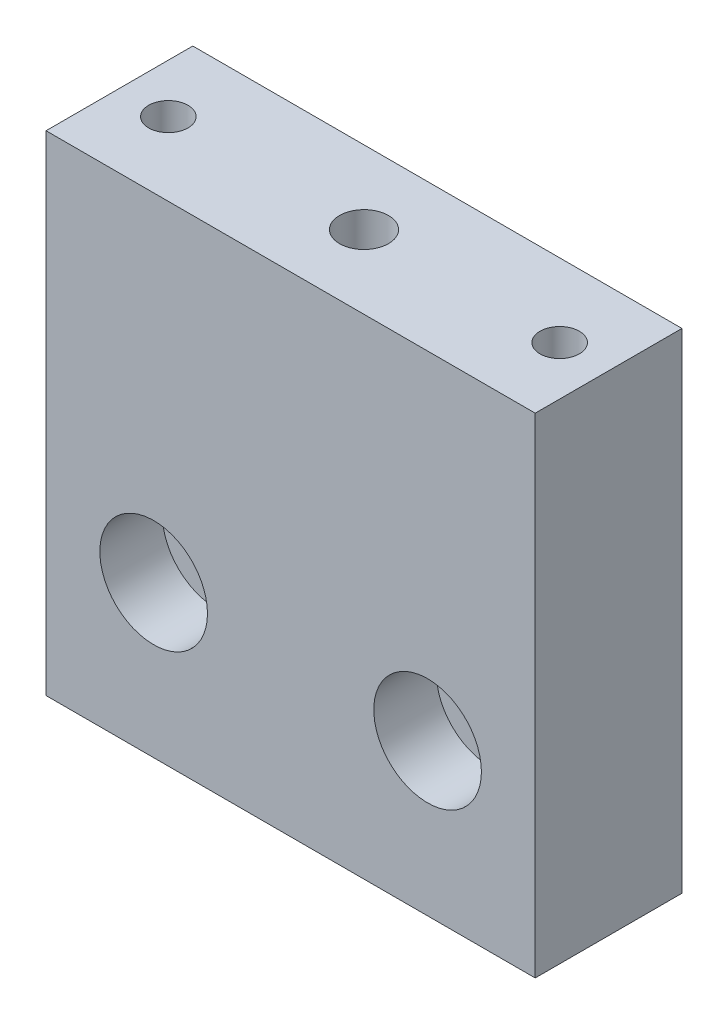
ISO-10303-21;
HEADER;
FILE_DESCRIPTION(('STEP AP214'),'2;1');
FILE_NAME('part.step','',(''),(''),'','','');
FILE_SCHEMA(('AUTOMOTIVE_DESIGN { 1 0 10303 214 1 1 1 1 }'));
ENDSEC;
DATA;
#1=APPLICATION_CONTEXT('core data for automotive mechanical design processes');
#2=APPLICATION_PROTOCOL_DEFINITION('international standard','automotive_design',2000,#1);
#3=PRODUCT_CONTEXT('',#1,'mechanical');
#4=PRODUCT('Part','Part','',(#3));
#5=PRODUCT_RELATED_PRODUCT_CATEGORY('part','',(#4));
#6=PRODUCT_DEFINITION_FORMATION('','',#4);
#7=PRODUCT_DEFINITION_CONTEXT('part definition',#1,'design');
#8=PRODUCT_DEFINITION('design','',#6,#7);
#9=PRODUCT_DEFINITION_SHAPE('','',#8);
#10=(LENGTH_UNIT() NAMED_UNIT(*) SI_UNIT(.MILLI.,.METRE.));
#11=(NAMED_UNIT(*) PLANE_ANGLE_UNIT() SI_UNIT($,.RADIAN.));
#12=(NAMED_UNIT(*) SI_UNIT($,.STERADIAN.) SOLID_ANGLE_UNIT());
#13=UNCERTAINTY_MEASURE_WITH_UNIT(LENGTH_MEASURE(1.E-05),#10,'distance_accuracy_value','');
#14=(GEOMETRIC_REPRESENTATION_CONTEXT(3) GLOBAL_UNCERTAINTY_ASSIGNED_CONTEXT((#13)) GLOBAL_UNIT_ASSIGNED_CONTEXT((#10,
#11,#12)) REPRESENTATION_CONTEXT('',''));
#15=CARTESIAN_POINT('',(0.,0.,0.));
#16=DIRECTION('',(0.,0.,1.));
#17=DIRECTION('',(1.,0.,0.));
#18=AXIS2_PLACEMENT_3D('',#15,#16,#17);
#19=CARTESIAN_POINT('',(-20.,16.9999999999391,7.5));
#20=DIRECTION('',(0.,1.,0.));
#21=DIRECTION('',(0.,0.,1.));
#22=AXIS2_PLACEMENT_3D('',#19,#20,#21);
#23=CONICAL_SURFACE('',#22,1.89999999997099,1.0297442586842);
#24=CARTESIAN_POINT('',(-20.,15.8583648238277,7.5));
#25=VERTEX_POINT('',#24);
#26=VERTEX_LOOP('',#25);
#27=FACE_BOUND('',#26,.T.);
#28=CARTESIAN_POINT('',(-20.,17.,7.5));
#29=DIRECTION('',(0.,1.,0.));
#30=DIRECTION('',(0.,0.,1.));
#31=AXIS2_PLACEMENT_3D('',#28,#29,#30);
#32=CIRCLE('',#31,1.90000000000001);
#33=CARTESIAN_POINT('',(-20.,17.,9.40000000000001));
#34=VERTEX_POINT('',#33);
#35=EDGE_CURVE('E68',#34,#34,#32,.T.);
#36=ORIENTED_EDGE('',*,*,#35,.T.);
#37=EDGE_LOOP('',(#36));
#38=FACE_BOUND('',#37,.T.);
#39=ADVANCED_FACE('F16',(#27,#38),#23,.F.);
#40=CARTESIAN_POINT('',(20.,16.9999999999391,7.49999999999999));
#41=DIRECTION('',(0.,1.,0.));
#42=DIRECTION('',(0.,0.,1.));
#43=AXIS2_PLACEMENT_3D('',#40,#41,#42);
#44=CONICAL_SURFACE('',#43,1.89999999997099,1.0297442586842);
#45=CARTESIAN_POINT('',(20.,15.8583648238277,7.49999999999999));
#46=VERTEX_POINT('',#45);
#47=VERTEX_LOOP('',#46);
#48=FACE_BOUND('',#47,.T.);
#49=CARTESIAN_POINT('',(20.,17.,7.49999999999999));
#50=DIRECTION('',(0.,1.,0.));
#51=DIRECTION('',(0.,0.,1.));
#52=AXIS2_PLACEMENT_3D('',#49,#50,#51);
#53=CIRCLE('',#52,1.90000000000001);
#54=CARTESIAN_POINT('',(20.,17.,9.4));
#55=VERTEX_POINT('',#54);
#56=EDGE_CURVE('E70',#55,#55,#53,.T.);
#57=ORIENTED_EDGE('',*,*,#56,.T.);
#58=EDGE_LOOP('',(#57));
#59=FACE_BOUND('',#58,.T.);
#60=ADVANCED_FACE('F65',(#48,#59),#44,.F.);
#61=CARTESIAN_POINT('',(-20.,25.,7.5));
#62=DIRECTION('',(0.,1.,0.));
#63=DIRECTION('',(0.,0.,1.));
#64=AXIS2_PLACEMENT_3D('',#61,#62,#63);
#65=CYLINDRICAL_SURFACE('',#64,1.90000000000001);
#66=ORIENTED_EDGE('',*,*,#35,.F.);
#67=EDGE_LOOP('',(#66));
#68=FACE_BOUND('',#67,.T.);
#69=CARTESIAN_POINT('',(-20.,20.,7.5));
#70=DIRECTION('',(0.,1.,0.));
#71=DIRECTION('',(0.,0.,1.));
#72=AXIS2_PLACEMENT_3D('',#69,#70,#71);
#73=CIRCLE('',#72,1.90000000000001);
#74=CARTESIAN_POINT('',(-20.,20.,9.40000000000001));
#75=VERTEX_POINT('',#74);
#76=EDGE_CURVE('E19',#75,#75,#73,.T.);
#77=ORIENTED_EDGE('',*,*,#76,.T.);
#78=EDGE_LOOP('',(#77));
#79=FACE_BOUND('',#78,.T.);
#80=ADVANCED_FACE('F127',(#68,#79),#65,.F.);
#81=CARTESIAN_POINT('',(20.,25.,7.49999999999999));
#82=DIRECTION('',(0.,1.,0.));
#83=DIRECTION('',(0.,0.,1.));
#84=AXIS2_PLACEMENT_3D('',#81,#82,#83);
#85=CYLINDRICAL_SURFACE('',#84,1.90000000000001);
#86=ORIENTED_EDGE('',*,*,#56,.F.);
#87=EDGE_LOOP('',(#86));
#88=FACE_BOUND('',#87,.T.);
#89=CARTESIAN_POINT('',(20.,20.,7.49999999999999));
#90=DIRECTION('',(0.,1.,0.));
#91=DIRECTION('',(0.,0.,1.));
#92=AXIS2_PLACEMENT_3D('',#89,#90,#91);
#93=CIRCLE('',#92,1.90000000000001);
#94=CARTESIAN_POINT('',(20.,20.,9.4));
#95=VERTEX_POINT('',#94);
#96=EDGE_CURVE('E120',#95,#95,#93,.T.);
#97=ORIENTED_EDGE('',*,*,#96,.T.);
#98=EDGE_LOOP('',(#97));
#99=FACE_BOUND('',#98,.T.);
#100=ADVANCED_FACE('F143',(#88,#99),#85,.F.);
#101=CARTESIAN_POINT('',(0.,7.00000000011869,7.5));
#102=DIRECTION('',(0.,1.,0.));
#103=DIRECTION('',(-1.,0.,0.));
#104=AXIS2_PLACEMENT_3D('',#101,#102,#103);
#105=CONICAL_SURFACE('',#104,2.50000000010459,1.0297442586752);
#106=CARTESIAN_POINT('',(0.,5.49784845259182,7.50000000008527));
#107=VERTEX_POINT('',#106);
#108=VERTEX_LOOP('',#107);
#109=FACE_BOUND('',#108,.T.);
#110=CARTESIAN_POINT('',(0.,7.00000000000001,7.5));
#111=DIRECTION('',(0.,1.,0.));
#112=DIRECTION('',(0.,0.,1.));
#113=AXIS2_PLACEMENT_3D('',#110,#111,#112);
#114=CIRCLE('',#113,2.5);
#115=CARTESIAN_POINT('',(0.,7.00000000000001,10.));
#116=VERTEX_POINT('',#115);
#117=EDGE_CURVE('E114',#116,#116,#114,.T.);
#118=ORIENTED_EDGE('',*,*,#117,.T.);
#119=EDGE_LOOP('',(#118));
#120=FACE_BOUND('',#119,.T.);
#121=ADVANCED_FACE('F132',(#109,#120),#105,.F.);
#122=CARTESIAN_POINT('',(-18.1,20.,7.5));
#123=DIRECTION('',(0.,-1.,0.));
#124=DIRECTION('',(0.,0.,-1.));
#125=AXIS2_PLACEMENT_3D('',#122,#123,#124);
#126=PLANE('',#125);
#127=CARTESIAN_POINT('',(-20.,20.,7.5));
#128=DIRECTION('',(0.,1.,0.));
#129=DIRECTION('',(0.,0.,1.));
#130=AXIS2_PLACEMENT_3D('',#127,#128,#129);
#131=CIRCLE('',#130,2.01);
#132=CARTESIAN_POINT('',(-20.,20.,9.51));
#133=VERTEX_POINT('',#132);
#134=EDGE_CURVE('E111',#133,#133,#131,.T.);
#135=ORIENTED_EDGE('',*,*,#134,.T.);
#136=EDGE_LOOP('',(#135));
#137=FACE_BOUND('',#136,.T.);
#138=ORIENTED_EDGE('',*,*,#76,.F.);
#139=EDGE_LOOP('',(#138));
#140=FACE_BOUND('',#139,.T.);
#141=ADVANCED_FACE('F129',(#137,#140),#126,.F.);
#142=CARTESIAN_POINT('',(21.9,20.,7.49999999999999));
#143=DIRECTION('',(0.,-1.,0.));
#144=DIRECTION('',(0.,0.,-1.));
#145=AXIS2_PLACEMENT_3D('',#142,#143,#144);
#146=PLANE('',#145);
#147=CARTESIAN_POINT('',(20.,20.,7.49999999999999));
#148=DIRECTION('',(0.,1.,0.));
#149=DIRECTION('',(0.,0.,1.));
#150=AXIS2_PLACEMENT_3D('',#147,#148,#149);
#151=CIRCLE('',#150,2.01);
#152=CARTESIAN_POINT('',(20.,20.,9.50999999999999));
#153=VERTEX_POINT('',#152);
#154=EDGE_CURVE('E108',#153,#153,#151,.T.);
#155=ORIENTED_EDGE('',*,*,#154,.T.);
#156=EDGE_LOOP('',(#155));
#157=FACE_BOUND('',#156,.T.);
#158=ORIENTED_EDGE('',*,*,#96,.F.);
#159=EDGE_LOOP('',(#158));
#160=FACE_BOUND('',#159,.T.);
#161=ADVANCED_FACE('F131',(#157,#160),#146,.F.);
#162=CARTESIAN_POINT('',(-14.,-9.49999999999999,15.));
#163=DIRECTION('',(0.,0.,1.));
#164=DIRECTION('',(1.,0.,0.));
#165=AXIS2_PLACEMENT_3D('',#162,#163,#164);
#166=CYLINDRICAL_SURFACE('',#165,5.5);
#167=CARTESIAN_POINT('',(-14.,-9.49999999999999,15.));
#168=DIRECTION('',(0.,0.,1.));
#169=DIRECTION('',(1.,0.,0.));
#170=AXIS2_PLACEMENT_3D('',#167,#168,#169);
#171=CIRCLE('',#170,5.5);
#172=CARTESIAN_POINT('',(-8.5,-9.49999999999999,15.));
#173=VERTEX_POINT('',#172);
#174=EDGE_CURVE('E105',#173,#173,#171,.F.);
#175=ORIENTED_EDGE('',*,*,#174,.F.);
#176=EDGE_LOOP('',(#175));
#177=FACE_BOUND('',#176,.T.);
#178=CARTESIAN_POINT('',(-14.,-9.49999999999999,8.6));
#179=DIRECTION('',(0.,0.,1.));
#180=DIRECTION('',(1.,0.,0.));
#181=AXIS2_PLACEMENT_3D('',#178,#179,#180);
#182=CIRCLE('',#181,5.5);
#183=CARTESIAN_POINT('',(-8.5,-9.49999999999999,8.6));
#184=VERTEX_POINT('',#183);
#185=EDGE_CURVE('E118',#184,#184,#182,.F.);
#186=ORIENTED_EDGE('',*,*,#185,.T.);
#187=EDGE_LOOP('',(#186));
#188=FACE_BOUND('',#187,.T.);
#189=ADVANCED_FACE('F140',(#177,#188),#166,.F.);
#190=CARTESIAN_POINT('',(14.,-9.49999999999999,15.));
#191=DIRECTION('',(0.,0.,1.));
#192=DIRECTION('',(1.,0.,0.));
#193=AXIS2_PLACEMENT_3D('',#190,#191,#192);
#194=CYLINDRICAL_SURFACE('',#193,5.5);
#195=CARTESIAN_POINT('',(14.,-9.49999999999999,15.));
#196=DIRECTION('',(0.,0.,1.));
#197=DIRECTION('',(1.,0.,0.));
#198=AXIS2_PLACEMENT_3D('',#195,#196,#197);
#199=CIRCLE('',#198,5.5);
#200=CARTESIAN_POINT('',(19.5,-9.49999999999999,15.));
#201=VERTEX_POINT('',#200);
#202=EDGE_CURVE('E102',#201,#201,#199,.F.);
#203=ORIENTED_EDGE('',*,*,#202,.F.);
#204=EDGE_LOOP('',(#203));
#205=FACE_BOUND('',#204,.T.);
#206=CARTESIAN_POINT('',(14.,-9.49999999999999,8.6));
#207=DIRECTION('',(0.,0.,1.));
#208=DIRECTION('',(1.,0.,0.));
#209=AXIS2_PLACEMENT_3D('',#206,#207,#208);
#210=CIRCLE('',#209,5.5);
#211=CARTESIAN_POINT('',(19.5,-9.49999999999999,8.6));
#212=VERTEX_POINT('',#211);
#213=EDGE_CURVE('E115',#212,#212,#210,.F.);
#214=ORIENTED_EDGE('',*,*,#213,.T.);
#215=EDGE_LOOP('',(#214));
#216=FACE_BOUND('',#215,.T.);
#217=ADVANCED_FACE('F201',(#205,#216),#194,.F.);
#218=CARTESIAN_POINT('',(-10.7,-9.49999999999999,8.6));
#219=DIRECTION('',(0.,0.,-1.));
#220=DIRECTION('',(-1.,0.,0.));
#221=AXIS2_PLACEMENT_3D('',#218,#219,#220);
#222=PLANE('',#221);
#223=ORIENTED_EDGE('',*,*,#185,.F.);
#224=EDGE_LOOP('',(#223));
#225=FACE_BOUND('',#224,.T.);
#226=CARTESIAN_POINT('',(-14.,-9.49999999999999,8.6));
#227=DIRECTION('',(0.,0.,1.));
#228=DIRECTION('',(1.,0.,0.));
#229=AXIS2_PLACEMENT_3D('',#226,#227,#228);
#230=CIRCLE('',#229,3.3);
#231=CARTESIAN_POINT('',(-10.7,-9.49999999999999,8.6));
#232=VERTEX_POINT('',#231);
#233=EDGE_CURVE('E99',#232,#232,#230,.F.);
#234=ORIENTED_EDGE('',*,*,#233,.T.);
#235=EDGE_LOOP('',(#234));
#236=FACE_BOUND('',#235,.T.);
#237=ADVANCED_FACE('F197',(#225,#236),#222,.F.);
#238=CARTESIAN_POINT('',(17.3,-9.49999999999999,8.6));
#239=DIRECTION('',(0.,0.,-1.));
#240=DIRECTION('',(-1.,0.,0.));
#241=AXIS2_PLACEMENT_3D('',#238,#239,#240);
#242=PLANE('',#241);
#243=ORIENTED_EDGE('',*,*,#213,.F.);
#244=EDGE_LOOP('',(#243));
#245=FACE_BOUND('',#244,.T.);
#246=CARTESIAN_POINT('',(14.,-9.49999999999999,8.6));
#247=DIRECTION('',(0.,0.,1.));
#248=DIRECTION('',(1.,0.,0.));
#249=AXIS2_PLACEMENT_3D('',#246,#247,#248);
#250=CIRCLE('',#249,3.3);
#251=CARTESIAN_POINT('',(17.3,-9.49999999999999,8.6));
#252=VERTEX_POINT('',#251);
#253=EDGE_CURVE('E95',#252,#252,#250,.F.);
#254=ORIENTED_EDGE('',*,*,#253,.T.);
#255=EDGE_LOOP('',(#254));
#256=FACE_BOUND('',#255,.T.);
#257=ADVANCED_FACE('F193',(#245,#256),#242,.F.);
#258=CARTESIAN_POINT('',(0.,25.,7.5));
#259=DIRECTION('',(0.,1.,0.));
#260=DIRECTION('',(0.,0.,1.));
#261=AXIS2_PLACEMENT_3D('',#258,#259,#260);
#262=CYLINDRICAL_SURFACE('',#261,2.5);
#263=ORIENTED_EDGE('',*,*,#117,.F.);
#264=EDGE_LOOP('',(#263));
#265=FACE_BOUND('',#264,.T.);
#266=CARTESIAN_POINT('',(0.,25.,7.5));
#267=DIRECTION('',(0.,1.,0.));
#268=DIRECTION('',(0.,0.,1.));
#269=AXIS2_PLACEMENT_3D('',#266,#267,#268);
#270=CIRCLE('',#269,2.5);
#271=CARTESIAN_POINT('',(0.,25.,10.));
#272=VERTEX_POINT('',#271);
#273=EDGE_CURVE('E91',#272,#272,#270,.T.);
#274=ORIENTED_EDGE('',*,*,#273,.T.);
#275=EDGE_LOOP('',(#274));
#276=FACE_BOUND('',#275,.T.);
#277=ADVANCED_FACE('F189',(#265,#276),#262,.F.);
#278=CARTESIAN_POINT('',(-20.,25.,7.5));
#279=DIRECTION('',(0.,1.,0.));
#280=DIRECTION('',(0.,0.,1.));
#281=AXIS2_PLACEMENT_3D('',#278,#279,#280);
#282=CYLINDRICAL_SURFACE('',#281,2.01);
#283=ORIENTED_EDGE('',*,*,#134,.F.);
#284=EDGE_LOOP('',(#283));
#285=FACE_BOUND('',#284,.T.);
#286=CARTESIAN_POINT('',(-20.,25.,7.5));
#287=DIRECTION('',(0.,1.,0.));
#288=DIRECTION('',(0.,0.,1.));
#289=AXIS2_PLACEMENT_3D('',#286,#287,#288);
#290=CIRCLE('',#289,2.01);
#291=CARTESIAN_POINT('',(-20.,25.,9.51));
#292=VERTEX_POINT('',#291);
#293=EDGE_CURVE('E88',#292,#292,#290,.T.);
#294=ORIENTED_EDGE('',*,*,#293,.T.);
#295=EDGE_LOOP('',(#294));
#296=FACE_BOUND('',#295,.T.);
#297=ADVANCED_FACE('F185',(#285,#296),#282,.F.);
#298=CARTESIAN_POINT('',(20.,25.,7.49999999999999));
#299=DIRECTION('',(0.,1.,0.));
#300=DIRECTION('',(0.,0.,1.));
#301=AXIS2_PLACEMENT_3D('',#298,#299,#300);
#302=CYLINDRICAL_SURFACE('',#301,2.01);
#303=ORIENTED_EDGE('',*,*,#154,.F.);
#304=EDGE_LOOP('',(#303));
#305=FACE_BOUND('',#304,.T.);
#306=CARTESIAN_POINT('',(20.,25.,7.49999999999999));
#307=DIRECTION('',(0.,1.,0.));
#308=DIRECTION('',(0.,0.,1.));
#309=AXIS2_PLACEMENT_3D('',#306,#307,#308);
#310=CIRCLE('',#309,2.01);
#311=CARTESIAN_POINT('',(20.,25.,9.50999999999999));
#312=VERTEX_POINT('',#311);
#313=EDGE_CURVE('E84',#312,#312,#310,.T.);
#314=ORIENTED_EDGE('',*,*,#313,.T.);
#315=EDGE_LOOP('',(#314));
#316=FACE_BOUND('',#315,.T.);
#317=ADVANCED_FACE('F181',(#305,#316),#302,.F.);
#318=CARTESIAN_POINT('',(0.,0.,15.));
#319=DIRECTION('',(0.,0.,1.));
#320=DIRECTION('',(1.,0.,0.));
#321=AXIS2_PLACEMENT_3D('',#318,#319,#320);
#322=PLANE('',#321);
#323=DIRECTION('',(0.,1.,0.));
#324=VECTOR('',#323,1.);
#325=CARTESIAN_POINT('',(25.,-25.,15.));
#326=LINE('',#325,#324);
#327=CARTESIAN_POINT('',(25.,-25.,15.));
#328=VERTEX_POINT('',#327);
#329=CARTESIAN_POINT('',(25.,25.,15.));
#330=VERTEX_POINT('',#329);
#331=EDGE_CURVE('E94',#328,#330,#326,.T.);
#332=ORIENTED_EDGE('',*,*,#331,.T.);
#333=DIRECTION('',(1.,0.,0.));
#334=VECTOR('',#333,1.);
#335=CARTESIAN_POINT('',(25.,25.,15.));
#336=LINE('',#335,#334);
#337=CARTESIAN_POINT('',(-25.,25.,15.));
#338=VERTEX_POINT('',#337);
#339=EDGE_CURVE('E414',#330,#338,#336,.F.);
#340=ORIENTED_EDGE('',*,*,#339,.T.);
#341=DIRECTION('',(0.,1.,0.));
#342=VECTOR('',#341,1.);
#343=CARTESIAN_POINT('',(-25.,-25.,15.));
#344=LINE('',#343,#342);
#345=CARTESIAN_POINT('',(-25.,-25.,15.));
#346=VERTEX_POINT('',#345);
#347=EDGE_CURVE('E417',#338,#346,#344,.F.);
#348=ORIENTED_EDGE('',*,*,#347,.T.);
#349=DIRECTION('',(-1.,0.,0.));
#350=VECTOR('',#349,1.);
#351=CARTESIAN_POINT('',(25.,-25.,15.));
#352=LINE('',#351,#350);
#353=EDGE_CURVE('E98',#346,#328,#352,.F.);
#354=ORIENTED_EDGE('',*,*,#353,.T.);
#355=EDGE_LOOP('',(#332,#340,#348,#354));
#356=FACE_BOUND('',#355,.T.);
#357=ORIENTED_EDGE('',*,*,#202,.T.);
#358=EDGE_LOOP('',(#357));
#359=FACE_BOUND('',#358,.T.);
#360=ORIENTED_EDGE('',*,*,#174,.T.);
#361=EDGE_LOOP('',(#360));
#362=FACE_BOUND('',#361,.T.);
#363=ADVANCED_FACE('F177',(#356,#359,#362),#322,.T.);
#364=CARTESIAN_POINT('',(-14.,-9.49999999999999,15.));
#365=DIRECTION('',(0.,0.,1.));
#366=DIRECTION('',(1.,0.,0.));
#367=AXIS2_PLACEMENT_3D('',#364,#365,#366);
#368=CYLINDRICAL_SURFACE('',#367,3.3);
#369=CARTESIAN_POINT('',(-14.,-9.49999999999999,0.));
#370=DIRECTION('',(0.,0.,1.));
#371=DIRECTION('',(1.,0.,0.));
#372=AXIS2_PLACEMENT_3D('',#369,#370,#371);
#373=CIRCLE('',#372,3.3);
#374=CARTESIAN_POINT('',(-10.7,-9.49999999999999,0.));
#375=VERTEX_POINT('',#374);
#376=EDGE_CURVE('E80',#375,#375,#373,.F.);
#377=ORIENTED_EDGE('',*,*,#376,.T.);
#378=EDGE_LOOP('',(#377));
#379=FACE_BOUND('',#378,.T.);
#380=ORIENTED_EDGE('',*,*,#233,.F.);
#381=EDGE_LOOP('',(#380));
#382=FACE_BOUND('',#381,.T.);
#383=ADVANCED_FACE('F173',(#379,#382),#368,.F.);
#384=CARTESIAN_POINT('',(14.,-9.49999999999999,15.));
#385=DIRECTION('',(0.,0.,1.));
#386=DIRECTION('',(1.,0.,0.));
#387=AXIS2_PLACEMENT_3D('',#384,#385,#386);
#388=CYLINDRICAL_SURFACE('',#387,3.3);
#389=CARTESIAN_POINT('',(14.,-9.49999999999999,0.));
#390=DIRECTION('',(0.,0.,1.));
#391=DIRECTION('',(1.,0.,0.));
#392=AXIS2_PLACEMENT_3D('',#389,#390,#391);
#393=CIRCLE('',#392,3.3);
#394=CARTESIAN_POINT('',(17.3,-9.49999999999999,0.));
#395=VERTEX_POINT('',#394);
#396=EDGE_CURVE('E76',#395,#395,#393,.F.);
#397=ORIENTED_EDGE('',*,*,#396,.T.);
#398=EDGE_LOOP('',(#397));
#399=FACE_BOUND('',#398,.T.);
#400=ORIENTED_EDGE('',*,*,#253,.F.);
#401=EDGE_LOOP('',(#400));
#402=FACE_BOUND('',#401,.T.);
#403=ADVANCED_FACE('F169',(#399,#402),#388,.F.);
#404=CARTESIAN_POINT('',(25.,-25.,15.));
#405=DIRECTION('',(0.,1.,0.));
#406=DIRECTION('',(-1.,0.,0.));
#407=AXIS2_PLACEMENT_3D('',#404,#405,#406);
#408=PLANE('',#407);
#409=DIRECTION('',(0.,0.,1.));
#410=VECTOR('',#409,1.);
#411=CARTESIAN_POINT('',(25.,-25.,15.));
#412=LINE('',#411,#410);
#413=CARTESIAN_POINT('',(25.,-25.,0.));
#414=VERTEX_POINT('',#413);
#415=EDGE_CURVE('E408',#414,#328,#412,.T.);
#416=ORIENTED_EDGE('',*,*,#415,.T.);
#417=ORIENTED_EDGE('',*,*,#353,.F.);
#418=DIRECTION('',(0.,0.,-1.));
#419=VECTOR('',#418,1.);
#420=CARTESIAN_POINT('',(-25.,-25.,15.));
#421=LINE('',#420,#419);
#422=CARTESIAN_POINT('',(-25.,-25.,0.));
#423=VERTEX_POINT('',#422);
#424=EDGE_CURVE('E83',#346,#423,#421,.T.);
#425=ORIENTED_EDGE('',*,*,#424,.T.);
#426=DIRECTION('',(1.,0.,0.));
#427=VECTOR('',#426,1.);
#428=CARTESIAN_POINT('',(0.,-25.,0.));
#429=LINE('',#428,#427);
#430=EDGE_CURVE('E79',#423,#414,#429,.T.);
#431=ORIENTED_EDGE('',*,*,#430,.T.);
#432=EDGE_LOOP('',(#416,#417,#425,#431));
#433=FACE_BOUND('',#432,.T.);
#434=ADVANCED_FACE('F165',(#433),#408,.F.);
#435=CARTESIAN_POINT('',(25.,-25.,15.));
#436=DIRECTION('',(-1.,0.,0.));
#437=DIRECTION('',(0.,0.,1.));
#438=AXIS2_PLACEMENT_3D('',#435,#436,#437);
#439=PLANE('',#438);
#440=DIRECTION('',(0.,0.,1.));
#441=VECTOR('',#440,1.);
#442=CARTESIAN_POINT('',(25.,25.,15.));
#443=LINE('',#442,#441);
#444=CARTESIAN_POINT('',(25.,25.,0.));
#445=VERTEX_POINT('',#444);
#446=EDGE_CURVE('E87',#445,#330,#443,.T.);
#447=ORIENTED_EDGE('',*,*,#446,.T.);
#448=ORIENTED_EDGE('',*,*,#331,.F.);
#449=ORIENTED_EDGE('',*,*,#415,.F.);
#450=DIRECTION('',(0.,1.,0.));
#451=VECTOR('',#450,1.);
#452=CARTESIAN_POINT('',(25.,0.,0.));
#453=LINE('',#452,#451);
#454=EDGE_CURVE('E424',#414,#445,#453,.T.);
#455=ORIENTED_EDGE('',*,*,#454,.T.);
#456=EDGE_LOOP('',(#447,#448,#449,#455));
#457=FACE_BOUND('',#456,.T.);
#458=ADVANCED_FACE('F161',(#457),#439,.F.);
#459=CARTESIAN_POINT('',(25.,25.,15.));
#460=DIRECTION('',(0.,-1.,0.));
#461=DIRECTION('',(1.,0.,0.));
#462=AXIS2_PLACEMENT_3D('',#459,#460,#461);
#463=PLANE('',#462);
#464=DIRECTION('',(0.,0.,-1.));
#465=VECTOR('',#464,1.);
#466=CARTESIAN_POINT('',(-25.,25.,15.));
#467=LINE('',#466,#465);
#468=CARTESIAN_POINT('',(-25.,25.,0.));
#469=VERTEX_POINT('',#468);
#470=EDGE_CURVE('E33',#469,#338,#467,.F.);
#471=ORIENTED_EDGE('',*,*,#470,.T.);
#472=ORIENTED_EDGE('',*,*,#339,.F.);
#473=ORIENTED_EDGE('',*,*,#446,.F.);
#474=DIRECTION('',(1.,0.,0.));
#475=VECTOR('',#474,1.);
#476=CARTESIAN_POINT('',(0.,25.,0.));
#477=LINE('',#476,#475);
#478=EDGE_CURVE('E25',#445,#469,#477,.F.);
#479=ORIENTED_EDGE('',*,*,#478,.T.);
#480=EDGE_LOOP('',(#471,#472,#473,#479));
#481=FACE_BOUND('',#480,.T.);
#482=ORIENTED_EDGE('',*,*,#313,.F.);
#483=EDGE_LOOP('',(#482));
#484=FACE_BOUND('',#483,.T.);
#485=ORIENTED_EDGE('',*,*,#293,.F.);
#486=EDGE_LOOP('',(#485));
#487=FACE_BOUND('',#486,.T.);
#488=ORIENTED_EDGE('',*,*,#273,.F.);
#489=EDGE_LOOP('',(#488));
#490=FACE_BOUND('',#489,.T.);
#491=ADVANCED_FACE('F154',(#481,#484,#487,#490),#463,.F.);
#492=CARTESIAN_POINT('',(-25.,-25.,15.));
#493=DIRECTION('',(1.,0.,0.));
#494=DIRECTION('',(0.,0.,-1.));
#495=AXIS2_PLACEMENT_3D('',#492,#493,#494);
#496=PLANE('',#495);
#497=ORIENTED_EDGE('',*,*,#424,.F.);
#498=ORIENTED_EDGE('',*,*,#347,.F.);
#499=ORIENTED_EDGE('',*,*,#470,.F.);
#500=DIRECTION('',(0.,1.,0.));
#501=VECTOR('',#500,1.);
#502=CARTESIAN_POINT('',(-25.,0.,0.));
#503=LINE('',#502,#501);
#504=EDGE_CURVE('E11',#469,#423,#503,.F.);
#505=ORIENTED_EDGE('',*,*,#504,.T.);
#506=EDGE_LOOP('',(#497,#498,#499,#505));
#507=FACE_BOUND('',#506,.T.);
#508=ADVANCED_FACE('F148',(#507),#496,.F.);
#509=CARTESIAN_POINT('',(0.,0.,0.));
#510=DIRECTION('',(0.,0.,1.));
#511=DIRECTION('',(1.,0.,0.));
#512=AXIS2_PLACEMENT_3D('',#509,#510,#511);
#513=PLANE('',#512);
#514=ORIENTED_EDGE('',*,*,#478,.F.);
#515=ORIENTED_EDGE('',*,*,#454,.F.);
#516=ORIENTED_EDGE('',*,*,#430,.F.);
#517=ORIENTED_EDGE('',*,*,#504,.F.);
#518=EDGE_LOOP('',(#514,#515,#516,#517));
#519=FACE_BOUND('',#518,.T.);
#520=ORIENTED_EDGE('',*,*,#396,.F.);
#521=EDGE_LOOP('',(#520));
#522=FACE_BOUND('',#521,.T.);
#523=ORIENTED_EDGE('',*,*,#376,.F.);
#524=EDGE_LOOP('',(#523));
#525=FACE_BOUND('',#524,.T.);
#526=ADVANCED_FACE('F146',(#519,#522,#525),#513,.F.);
#527=CLOSED_SHELL('',(#39,#60,#80,#100,#121,#141,#161,#189,#217,#237,#257,#277,#297,#317,#363,
#383,#403,#434,#458,#491,#508,#526));
#528=MANIFOLD_SOLID_BREP('B1',#527);
#529=ADVANCED_BREP_SHAPE_REPRESENTATION('',(#18,#528),#14);
#530=SHAPE_DEFINITION_REPRESENTATION(#9,#529);
ENDSEC;
END-ISO-10303-21;
